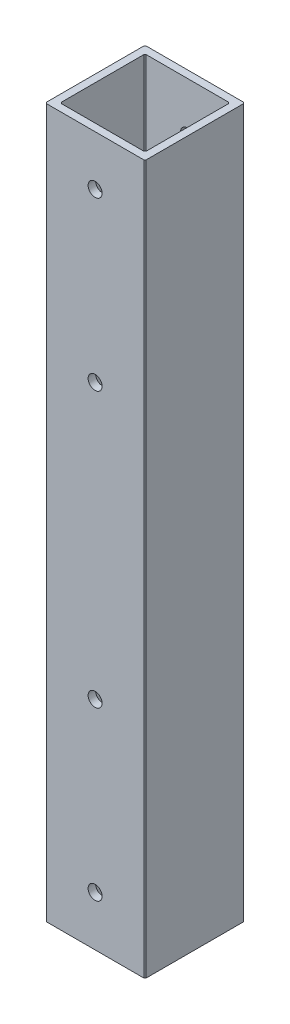
ISO-10303-21;
HEADER;
FILE_DESCRIPTION(('STEP AP214'),'2;1');
FILE_NAME('part.step','',(''),(''),'','','');
FILE_SCHEMA(('AUTOMOTIVE_DESIGN { 1 0 10303 214 1 1 1 1 }'));
ENDSEC;
DATA;
#1=APPLICATION_CONTEXT('core data for automotive mechanical design processes');
#2=APPLICATION_PROTOCOL_DEFINITION('international standard','automotive_design',2000,#1);
#3=PRODUCT_CONTEXT('',#1,'mechanical');
#4=PRODUCT('Part','Part','',(#3));
#5=PRODUCT_RELATED_PRODUCT_CATEGORY('part','',(#4));
#6=PRODUCT_DEFINITION_FORMATION('','',#4);
#7=PRODUCT_DEFINITION_CONTEXT('part definition',#1,'design');
#8=PRODUCT_DEFINITION('design','',#6,#7);
#9=PRODUCT_DEFINITION_SHAPE('','',#8);
#10=(LENGTH_UNIT() NAMED_UNIT(*) SI_UNIT(.MILLI.,.METRE.));
#11=(NAMED_UNIT(*) PLANE_ANGLE_UNIT() SI_UNIT($,.RADIAN.));
#12=(NAMED_UNIT(*) SI_UNIT($,.STERADIAN.) SOLID_ANGLE_UNIT());
#13=UNCERTAINTY_MEASURE_WITH_UNIT(LENGTH_MEASURE(1.E-05),#10,'distance_accuracy_value','');
#14=(GEOMETRIC_REPRESENTATION_CONTEXT(3) GLOBAL_UNCERTAINTY_ASSIGNED_CONTEXT((#13)) GLOBAL_UNIT_ASSIGNED_CONTEXT((#10,
#11,#12)) REPRESENTATION_CONTEXT('',''));
#15=CARTESIAN_POINT('',(0.,0.,0.));
#16=DIRECTION('',(0.,0.,1.));
#17=DIRECTION('',(1.,0.,0.));
#18=AXIS2_PLACEMENT_3D('',#15,#16,#17);
#19=CARTESIAN_POINT('',(0.,0.,140.));
#20=DIRECTION('',(0.,0.,1.));
#21=DIRECTION('',(1.,0.,0.));
#22=AXIS2_PLACEMENT_3D('',#19,#20,#21);
#23=PLANE('',#22);
#24=CARTESIAN_POINT('',(100.,55.,140.));
#25=DIRECTION('',(0.,0.,-1.));
#26=DIRECTION('',(-1.,0.,0.));
#27=AXIS2_PLACEMENT_3D('',#24,#25,#26);
#28=CIRCLE('',#27,2.79999999999998);
#29=CARTESIAN_POINT('',(97.2,55.,140.));
#30=VERTEX_POINT('',#29);
#31=EDGE_CURVE('E536',#30,#30,#28,.T.);
#32=ORIENTED_EDGE('',*,*,#31,.F.);
#33=EDGE_LOOP('',(#32));
#34=FACE_BOUND('',#33,.T.);
#35=CARTESIAN_POINT('',(100.,-122.,140.));
#36=DIRECTION('',(0.,0.,-1.));
#37=DIRECTION('',(-1.,0.,0.));
#38=AXIS2_PLACEMENT_3D('',#35,#36,#37);
#39=CIRCLE('',#38,2.79999999999998);
#40=CARTESIAN_POINT('',(97.2,-122.,140.));
#41=VERTEX_POINT('',#40);
#42=EDGE_CURVE('E551',#41,#41,#39,.T.);
#43=ORIENTED_EDGE('',*,*,#42,.F.);
#44=EDGE_LOOP('',(#43));
#45=FACE_BOUND('',#44,.T.);
#46=DIRECTION('',(-1.,0.,0.));
#47=VECTOR('',#46,1.);
#48=CARTESIAN_POINT('',(120.,142.,140.));
#49=LINE('',#48,#47);
#50=CARTESIAN_POINT('',(119.5,142.,140.));
#51=VERTEX_POINT('',#50);
#52=CARTESIAN_POINT('',(80.5000000000001,142.,140.));
#53=VERTEX_POINT('',#52);
#54=EDGE_CURVE('E336',#51,#53,#49,.T.);
#55=ORIENTED_EDGE('',*,*,#54,.F.);
#56=DIRECTION('',(0.,-1.,0.));
#57=VECTOR('',#56,1.);
#58=CARTESIAN_POINT('',(119.5,-142.,140.));
#59=LINE('',#58,#57);
#60=CARTESIAN_POINT('',(119.5,-142.,140.));
#61=VERTEX_POINT('',#60);
#62=EDGE_CURVE('E209',#51,#61,#59,.T.);
#63=ORIENTED_EDGE('',*,*,#62,.T.);
#64=DIRECTION('',(1.,0.,0.));
#65=VECTOR('',#64,1.);
#66=CARTESIAN_POINT('',(80.,-142.,140.));
#67=LINE('',#66,#65);
#68=CARTESIAN_POINT('',(80.5,-142.,140.));
#69=VERTEX_POINT('',#68);
#70=EDGE_CURVE('E167',#69,#61,#67,.T.);
#71=ORIENTED_EDGE('',*,*,#70,.F.);
#72=DIRECTION('',(0.,1.,0.));
#73=VECTOR('',#72,1.);
#74=CARTESIAN_POINT('',(80.5000000000001,142.,140.));
#75=LINE('',#74,#73);
#76=EDGE_CURVE('E206',#69,#53,#75,.T.);
#77=ORIENTED_EDGE('',*,*,#76,.T.);
#78=EDGE_LOOP('',(#55,#63,#71,#77));
#79=FACE_BOUND('',#78,.T.);
#80=CARTESIAN_POINT('',(100.,-55.,140.));
#81=DIRECTION('',(0.,0.,-1.));
#82=DIRECTION('',(-1.,0.,0.));
#83=AXIS2_PLACEMENT_3D('',#80,#81,#82);
#84=CIRCLE('',#83,2.79999999999998);
#85=CARTESIAN_POINT('',(97.2,-55.,140.));
#86=VERTEX_POINT('',#85);
#87=EDGE_CURVE('E544',#86,#86,#84,.T.);
#88=ORIENTED_EDGE('',*,*,#87,.F.);
#89=EDGE_LOOP('',(#88));
#90=FACE_BOUND('',#89,.T.);
#91=CARTESIAN_POINT('',(100.,122.,140.));
#92=DIRECTION('',(0.,0.,-1.));
#93=DIRECTION('',(-1.,0.,0.));
#94=AXIS2_PLACEMENT_3D('',#91,#92,#93);
#95=CIRCLE('',#94,2.79999999999998);
#96=CARTESIAN_POINT('',(97.2,122.,140.));
#97=VERTEX_POINT('',#96);
#98=EDGE_CURVE('E528',#97,#97,#95,.T.);
#99=ORIENTED_EDGE('',*,*,#98,.F.);
#100=EDGE_LOOP('',(#99));
#101=FACE_BOUND('',#100,.T.);
#102=ADVANCED_FACE('F45',(#34,#45,#79,#90,#101),#23,.F.);
#103=CARTESIAN_POINT('',(80.0000000000001,142.,140.));
#104=DIRECTION('',(-1.,0.,0.));
#105=DIRECTION('',(0.,-1.,0.));
#106=AXIS2_PLACEMENT_3D('',#103,#104,#105);
#107=PLANE('',#106);
#108=DIRECTION('',(0.,0.,1.));
#109=VECTOR('',#108,1.);
#110=CARTESIAN_POINT('',(80.0000000000001,142.,140.));
#111=LINE('',#110,#109);
#112=CARTESIAN_POINT('',(80.0000000000001,142.,140.5));
#113=VERTEX_POINT('',#112);
#114=CARTESIAN_POINT('',(80.0000000000001,142.,179.5));
#115=VERTEX_POINT('',#114);
#116=EDGE_CURVE('E195',#113,#115,#111,.T.);
#117=ORIENTED_EDGE('',*,*,#116,.F.);
#118=DIRECTION('',(0.,-1.,0.));
#119=VECTOR('',#118,1.);
#120=CARTESIAN_POINT('',(80.,-142.,140.5));
#121=LINE('',#120,#119);
#122=CARTESIAN_POINT('',(80.,-142.,140.5));
#123=VERTEX_POINT('',#122);
#124=EDGE_CURVE('E221',#113,#123,#121,.T.);
#125=ORIENTED_EDGE('',*,*,#124,.T.);
#126=DIRECTION('',(0.,0.,1.));
#127=VECTOR('',#126,1.);
#128=CARTESIAN_POINT('',(80.,-142.,140.));
#129=LINE('',#128,#127);
#130=CARTESIAN_POINT('',(80.,-142.,179.5));
#131=VERTEX_POINT('',#130);
#132=EDGE_CURVE('E184',#123,#131,#129,.T.);
#133=ORIENTED_EDGE('',*,*,#132,.T.);
#134=DIRECTION('',(0.,1.,0.));
#135=VECTOR('',#134,1.);
#136=CARTESIAN_POINT('',(80.0000000000001,142.,179.5));
#137=LINE('',#136,#135);
#138=EDGE_CURVE('E172',#131,#115,#137,.T.);
#139=ORIENTED_EDGE('',*,*,#138,.T.);
#140=EDGE_LOOP('',(#117,#125,#133,#139));
#141=FACE_BOUND('',#140,.T.);
#142=ADVANCED_FACE('F355',(#141),#107,.T.);
#143=CARTESIAN_POINT('',(120.,142.,140.));
#144=DIRECTION('',(0.,1.,0.));
#145=DIRECTION('',(0.,0.,1.));
#146=AXIS2_PLACEMENT_3D('',#143,#144,#145);
#147=PLANE('',#146);
#148=DIRECTION('',(0.,0.,-1.));
#149=VECTOR('',#148,1.);
#150=CARTESIAN_POINT('',(83.,142.,177.));
#151=LINE('',#150,#149);
#152=CARTESIAN_POINT('',(83.,142.,176.5));
#153=VERTEX_POINT('',#152);
#154=CARTESIAN_POINT('',(83.,142.,143.5));
#155=VERTEX_POINT('',#154);
#156=EDGE_CURVE('E304',#153,#155,#151,.T.);
#157=ORIENTED_EDGE('',*,*,#156,.T.);
#158=DIRECTION('',(-0.707106781186548,0.,0.707106781186548));
#159=VECTOR('',#158,1.);
#160=CARTESIAN_POINT('',(83.5,142.,143.));
#161=LINE('',#160,#159);
#162=CARTESIAN_POINT('',(83.5,142.,143.));
#163=VERTEX_POINT('',#162);
#164=EDGE_CURVE('E11',#155,#163,#161,.F.);
#165=ORIENTED_EDGE('',*,*,#164,.T.);
#166=DIRECTION('',(1.,0.,0.));
#167=VECTOR('',#166,1.);
#168=CARTESIAN_POINT('',(83.,142.,143.));
#169=LINE('',#168,#167);
#170=CARTESIAN_POINT('',(116.5,142.,143.));
#171=VERTEX_POINT('',#170);
#172=EDGE_CURVE('E294',#163,#171,#169,.T.);
#173=ORIENTED_EDGE('',*,*,#172,.T.);
#174=DIRECTION('',(-0.707106781186548,0.,-0.707106781186548));
#175=VECTOR('',#174,1.);
#176=CARTESIAN_POINT('',(117.,142.,143.5));
#177=LINE('',#176,#175);
#178=CARTESIAN_POINT('',(117.,142.,143.5));
#179=VERTEX_POINT('',#178);
#180=EDGE_CURVE('E269',#171,#179,#177,.F.);
#181=ORIENTED_EDGE('',*,*,#180,.T.);
#182=DIRECTION('',(0.,0.,1.));
#183=VECTOR('',#182,1.);
#184=CARTESIAN_POINT('',(117.,142.,143.));
#185=LINE('',#184,#183);
#186=CARTESIAN_POINT('',(117.,142.,176.5));
#187=VERTEX_POINT('',#186);
#188=EDGE_CURVE('E309',#179,#187,#185,.T.);
#189=ORIENTED_EDGE('',*,*,#188,.T.);
#190=DIRECTION('',(0.707106781186548,0.,-0.707106781186548));
#191=VECTOR('',#190,1.);
#192=CARTESIAN_POINT('',(116.5,142.,177.));
#193=LINE('',#192,#191);
#194=CARTESIAN_POINT('',(116.5,142.,177.));
#195=VERTEX_POINT('',#194);
#196=EDGE_CURVE('E275',#187,#195,#193,.F.);
#197=ORIENTED_EDGE('',*,*,#196,.T.);
#198=DIRECTION('',(-1.,0.,0.));
#199=VECTOR('',#198,1.);
#200=CARTESIAN_POINT('',(117.,142.,177.));
#201=LINE('',#200,#199);
#202=CARTESIAN_POINT('',(83.5,142.,177.));
#203=VERTEX_POINT('',#202);
#204=EDGE_CURVE('E313',#195,#203,#201,.T.);
#205=ORIENTED_EDGE('',*,*,#204,.T.);
#206=DIRECTION('',(0.707106781186548,0.,0.707106781186548));
#207=VECTOR('',#206,1.);
#208=CARTESIAN_POINT('',(83.,142.,176.5));
#209=LINE('',#208,#207);
#210=EDGE_CURVE('E263',#203,#153,#209,.F.);
#211=ORIENTED_EDGE('',*,*,#210,.T.);
#212=EDGE_LOOP('',(#157,#165,#173,#181,#189,#197,#205,#211));
#213=FACE_BOUND('',#212,.T.);
#214=DIRECTION('',(0.,0.,1.));
#215=VECTOR('',#214,1.);
#216=CARTESIAN_POINT('',(120.,142.,140.));
#217=LINE('',#216,#215);
#218=CARTESIAN_POINT('',(120.,142.,140.5));
#219=VERTEX_POINT('',#218);
#220=CARTESIAN_POINT('',(120.,142.,179.5));
#221=VERTEX_POINT('',#220);
#222=EDGE_CURVE('E183',#219,#221,#217,.T.);
#223=ORIENTED_EDGE('',*,*,#222,.F.);
#224=DIRECTION('',(-0.707106781186552,0.,-0.707106781186543));
#225=VECTOR('',#224,1.);
#226=CARTESIAN_POINT('',(119.75,142.,140.25));
#227=LINE('',#226,#225);
#228=EDGE_CURVE('E187',#219,#51,#227,.T.);
#229=ORIENTED_EDGE('',*,*,#228,.T.);
#230=ORIENTED_EDGE('',*,*,#54,.T.);
#231=DIRECTION('',(-0.707106781186552,0.,0.707106781186543));
#232=VECTOR('',#231,1.);
#233=CARTESIAN_POINT('',(100.25,142.,120.25));
#234=LINE('',#233,#232);
#235=EDGE_CURVE('E201',#53,#113,#234,.T.);
#236=ORIENTED_EDGE('',*,*,#235,.T.);
#237=ORIENTED_EDGE('',*,*,#116,.T.);
#238=DIRECTION('',(-0.707106781186552,0.,-0.707106781186543));
#239=VECTOR('',#238,1.);
#240=CARTESIAN_POINT('',(80.2500000000003,142.,179.75));
#241=LINE('',#240,#239);
#242=CARTESIAN_POINT('',(80.5,142.,180.));
#243=VERTEX_POINT('',#242);
#244=EDGE_CURVE('E193',#115,#243,#241,.F.);
#245=ORIENTED_EDGE('',*,*,#244,.T.);
#246=DIRECTION('',(-1.,0.,0.));
#247=VECTOR('',#246,1.);
#248=CARTESIAN_POINT('',(120.,142.,180.));
#249=LINE('',#248,#247);
#250=CARTESIAN_POINT('',(119.5,142.,180.));
#251=VERTEX_POINT('',#250);
#252=EDGE_CURVE('E337',#251,#243,#249,.T.);
#253=ORIENTED_EDGE('',*,*,#252,.F.);
#254=DIRECTION('',(-0.707106781186552,0.,0.707106781186543));
#255=VECTOR('',#254,1.);
#256=CARTESIAN_POINT('',(139.75,142.,159.75));
#257=LINE('',#256,#255);
#258=EDGE_CURVE('E189',#251,#221,#257,.F.);
#259=ORIENTED_EDGE('',*,*,#258,.T.);
#260=EDGE_LOOP('',(#223,#229,#230,#236,#237,#245,#253,#259));
#261=FACE_BOUND('',#260,.T.);
#262=ADVANCED_FACE('F301',(#213,#261),#147,.T.);
#263=CARTESIAN_POINT('',(120.,-142.,140.));
#264=DIRECTION('',(1.,0.,0.));
#265=DIRECTION('',(0.,1.,0.));
#266=AXIS2_PLACEMENT_3D('',#263,#264,#265);
#267=PLANE('',#266);
#268=DIRECTION('',(0.,0.,1.));
#269=VECTOR('',#268,1.);
#270=CARTESIAN_POINT('',(120.,-142.,140.));
#271=LINE('',#270,#269);
#272=CARTESIAN_POINT('',(120.,-142.,140.5));
#273=VERTEX_POINT('',#272);
#274=CARTESIAN_POINT('',(120.,-142.,179.5));
#275=VERTEX_POINT('',#274);
#276=EDGE_CURVE('E164',#273,#275,#271,.T.);
#277=ORIENTED_EDGE('',*,*,#276,.F.);
#278=DIRECTION('',(0.,1.,0.));
#279=VECTOR('',#278,1.);
#280=CARTESIAN_POINT('',(120.,142.,140.5));
#281=LINE('',#280,#279);
#282=EDGE_CURVE('E178',#273,#219,#281,.T.);
#283=ORIENTED_EDGE('',*,*,#282,.T.);
#284=ORIENTED_EDGE('',*,*,#222,.T.);
#285=DIRECTION('',(0.,-1.,0.));
#286=VECTOR('',#285,1.);
#287=CARTESIAN_POINT('',(120.,-142.,179.5));
#288=LINE('',#287,#286);
#289=EDGE_CURVE('E181',#221,#275,#288,.T.);
#290=ORIENTED_EDGE('',*,*,#289,.T.);
#291=EDGE_LOOP('',(#277,#283,#284,#290));
#292=FACE_BOUND('',#291,.T.);
#293=ADVANCED_FACE('F176',(#292),#267,.T.);
#294=CARTESIAN_POINT('',(80.,-142.,140.));
#295=DIRECTION('',(0.,-1.,0.));
#296=DIRECTION('',(0.,0.,-1.));
#297=AXIS2_PLACEMENT_3D('',#294,#295,#296);
#298=PLANE('',#297);
#299=DIRECTION('',(1.,0.,0.));
#300=VECTOR('',#299,1.);
#301=CARTESIAN_POINT('',(83.,-142.,143.));
#302=LINE('',#301,#300);
#303=CARTESIAN_POINT('',(83.5,-142.,143.));
#304=VERTEX_POINT('',#303);
#305=CARTESIAN_POINT('',(116.5,-142.,143.));
#306=VERTEX_POINT('',#305);
#307=EDGE_CURVE('E284',#304,#306,#302,.T.);
#308=ORIENTED_EDGE('',*,*,#307,.F.);
#309=DIRECTION('',(0.707106781186548,0.,-0.707106781186548));
#310=VECTOR('',#309,1.);
#311=CARTESIAN_POINT('',(83.5,-142.,143.));
#312=LINE('',#311,#310);
#313=CARTESIAN_POINT('',(83.,-142.,143.5));
#314=VERTEX_POINT('',#313);
#315=EDGE_CURVE('E55',#304,#314,#312,.F.);
#316=ORIENTED_EDGE('',*,*,#315,.T.);
#317=DIRECTION('',(0.,0.,-1.));
#318=VECTOR('',#317,1.);
#319=CARTESIAN_POINT('',(83.,-142.,177.));
#320=LINE('',#319,#318);
#321=CARTESIAN_POINT('',(83.,-142.,176.5));
#322=VERTEX_POINT('',#321);
#323=EDGE_CURVE('E282',#322,#314,#320,.T.);
#324=ORIENTED_EDGE('',*,*,#323,.F.);
#325=DIRECTION('',(-0.707106781186548,0.,-0.707106781186548));
#326=VECTOR('',#325,1.);
#327=CARTESIAN_POINT('',(83.,-142.,176.5));
#328=LINE('',#327,#326);
#329=CARTESIAN_POINT('',(83.5,-142.,177.));
#330=VERTEX_POINT('',#329);
#331=EDGE_CURVE('E260',#322,#330,#328,.F.);
#332=ORIENTED_EDGE('',*,*,#331,.T.);
#333=DIRECTION('',(-1.,0.,0.));
#334=VECTOR('',#333,1.);
#335=CARTESIAN_POINT('',(117.,-142.,177.));
#336=LINE('',#335,#334);
#337=CARTESIAN_POINT('',(116.5,-142.,177.));
#338=VERTEX_POINT('',#337);
#339=EDGE_CURVE('E295',#338,#330,#336,.T.);
#340=ORIENTED_EDGE('',*,*,#339,.F.);
#341=DIRECTION('',(-0.707106781186548,0.,0.707106781186548));
#342=VECTOR('',#341,1.);
#343=CARTESIAN_POINT('',(116.5,-142.,177.));
#344=LINE('',#343,#342);
#345=CARTESIAN_POINT('',(117.,-142.,176.5));
#346=VERTEX_POINT('',#345);
#347=EDGE_CURVE('E272',#338,#346,#344,.F.);
#348=ORIENTED_EDGE('',*,*,#347,.T.);
#349=DIRECTION('',(0.,0.,1.));
#350=VECTOR('',#349,1.);
#351=CARTESIAN_POINT('',(117.,-142.,143.));
#352=LINE('',#351,#350);
#353=CARTESIAN_POINT('',(117.,-142.,143.5));
#354=VERTEX_POINT('',#353);
#355=EDGE_CURVE('E327',#354,#346,#352,.T.);
#356=ORIENTED_EDGE('',*,*,#355,.F.);
#357=DIRECTION('',(0.707106781186548,0.,0.707106781186548));
#358=VECTOR('',#357,1.);
#359=CARTESIAN_POINT('',(117.,-142.,143.5));
#360=LINE('',#359,#358);
#361=EDGE_CURVE('E266',#354,#306,#360,.F.);
#362=ORIENTED_EDGE('',*,*,#361,.T.);
#363=EDGE_LOOP('',(#308,#316,#324,#332,#340,#348,#356,#362));
#364=FACE_BOUND('',#363,.T.);
#365=ORIENTED_EDGE('',*,*,#70,.T.);
#366=DIRECTION('',(0.707106781186552,0.,0.707106781186543));
#367=VECTOR('',#366,1.);
#368=CARTESIAN_POINT('',(99.7499999999997,-142.,120.25));
#369=LINE('',#368,#367);
#370=EDGE_CURVE('E161',#61,#273,#369,.T.);
#371=ORIENTED_EDGE('',*,*,#370,.T.);
#372=ORIENTED_EDGE('',*,*,#276,.T.);
#373=DIRECTION('',(0.707106781186552,0.,-0.707106781186543));
#374=VECTOR('',#373,1.);
#375=CARTESIAN_POINT('',(119.75,-142.,179.75));
#376=LINE('',#375,#374);
#377=CARTESIAN_POINT('',(119.5,-142.,180.));
#378=VERTEX_POINT('',#377);
#379=EDGE_CURVE('E212',#275,#378,#376,.F.);
#380=ORIENTED_EDGE('',*,*,#379,.T.);
#381=DIRECTION('',(1.,0.,0.));
#382=VECTOR('',#381,1.);
#383=CARTESIAN_POINT('',(80.,-142.,180.));
#384=LINE('',#383,#382);
#385=CARTESIAN_POINT('',(80.4999999999999,-142.,180.));
#386=VERTEX_POINT('',#385);
#387=EDGE_CURVE('E324',#386,#378,#384,.T.);
#388=ORIENTED_EDGE('',*,*,#387,.F.);
#389=DIRECTION('',(0.707106781186552,0.,0.707106781186543));
#390=VECTOR('',#389,1.);
#391=CARTESIAN_POINT('',(60.25,-142.,159.75));
#392=LINE('',#391,#390);
#393=EDGE_CURVE('E62',#386,#131,#392,.F.);
#394=ORIENTED_EDGE('',*,*,#393,.T.);
#395=ORIENTED_EDGE('',*,*,#132,.F.);
#396=DIRECTION('',(0.707106781186552,0.,-0.707106781186543));
#397=VECTOR('',#396,1.);
#398=CARTESIAN_POINT('',(80.25,-142.,140.25));
#399=LINE('',#398,#397);
#400=EDGE_CURVE('E70',#123,#69,#399,.T.);
#401=ORIENTED_EDGE('',*,*,#400,.T.);
#402=EDGE_LOOP('',(#365,#371,#372,#380,#388,#394,#395,#401));
#403=FACE_BOUND('',#402,.T.);
#404=ADVANCED_FACE('F163',(#364,#403),#298,.T.);
#405=CARTESIAN_POINT('',(0.,0.,180.));
#406=DIRECTION('',(0.,0.,1.));
#407=DIRECTION('',(1.,0.,0.));
#408=AXIS2_PLACEMENT_3D('',#405,#406,#407);
#409=PLANE('',#408);
#410=CARTESIAN_POINT('',(100.,122.,180.));
#411=DIRECTION('',(0.,0.,-1.));
#412=DIRECTION('',(-1.,0.,0.));
#413=AXIS2_PLACEMENT_3D('',#410,#411,#412);
#414=CIRCLE('',#413,2.79999999999998);
#415=CARTESIAN_POINT('',(97.2,122.,180.));
#416=VERTEX_POINT('',#415);
#417=EDGE_CURVE('E495',#416,#416,#414,.T.);
#418=ORIENTED_EDGE('',*,*,#417,.T.);
#419=EDGE_LOOP('',(#418));
#420=FACE_BOUND('',#419,.T.);
#421=CARTESIAN_POINT('',(100.,55.,180.));
#422=DIRECTION('',(0.,0.,-1.));
#423=DIRECTION('',(-1.,0.,0.));
#424=AXIS2_PLACEMENT_3D('',#421,#422,#423);
#425=CIRCLE('',#424,2.79999999999998);
#426=CARTESIAN_POINT('',(97.2,55.,180.));
#427=VERTEX_POINT('',#426);
#428=EDGE_CURVE('E508',#427,#427,#425,.T.);
#429=ORIENTED_EDGE('',*,*,#428,.T.);
#430=EDGE_LOOP('',(#429));
#431=FACE_BOUND('',#430,.T.);
#432=CARTESIAN_POINT('',(100.,-55.,180.));
#433=DIRECTION('',(0.,0.,-1.));
#434=DIRECTION('',(-1.,0.,0.));
#435=AXIS2_PLACEMENT_3D('',#432,#433,#434);
#436=CIRCLE('',#435,2.79999999999998);
#437=CARTESIAN_POINT('',(97.2,-55.,180.));
#438=VERTEX_POINT('',#437);
#439=EDGE_CURVE('E516',#438,#438,#436,.T.);
#440=ORIENTED_EDGE('',*,*,#439,.T.);
#441=EDGE_LOOP('',(#440));
#442=FACE_BOUND('',#441,.T.);
#443=CARTESIAN_POINT('',(100.,-122.,180.));
#444=DIRECTION('',(0.,0.,-1.));
#445=DIRECTION('',(-1.,0.,0.));
#446=AXIS2_PLACEMENT_3D('',#443,#444,#445);
#447=CIRCLE('',#446,2.79999999999998);
#448=CARTESIAN_POINT('',(97.2,-122.,180.));
#449=VERTEX_POINT('',#448);
#450=EDGE_CURVE('E524',#449,#449,#447,.T.);
#451=ORIENTED_EDGE('',*,*,#450,.T.);
#452=EDGE_LOOP('',(#451));
#453=FACE_BOUND('',#452,.T.);
#454=ORIENTED_EDGE('',*,*,#252,.T.);
#455=DIRECTION('',(0.,-1.,0.));
#456=VECTOR('',#455,1.);
#457=CARTESIAN_POINT('',(80.5,0.,180.));
#458=LINE('',#457,#456);
#459=EDGE_CURVE('E228',#243,#386,#458,.T.);
#460=ORIENTED_EDGE('',*,*,#459,.T.);
#461=ORIENTED_EDGE('',*,*,#387,.T.);
#462=DIRECTION('',(0.,1.,0.));
#463=VECTOR('',#462,1.);
#464=CARTESIAN_POINT('',(119.5,0.,180.));
#465=LINE('',#464,#463);
#466=EDGE_CURVE('E224',#378,#251,#465,.T.);
#467=ORIENTED_EDGE('',*,*,#466,.T.);
#468=EDGE_LOOP('',(#454,#460,#461,#467));
#469=FACE_BOUND('',#468,.T.);
#470=ADVANCED_FACE('F362',(#420,#431,#442,#453,#469),#409,.T.);
#471=CARTESIAN_POINT('',(83.,142.,143.));
#472=DIRECTION('',(0.,0.,-1.));
#473=DIRECTION('',(-1.,0.,0.));
#474=AXIS2_PLACEMENT_3D('',#471,#472,#473);
#475=PLANE('',#474);
#476=CARTESIAN_POINT('',(100.,122.,143.));
#477=DIRECTION('',(0.,0.,-1.));
#478=DIRECTION('',(-1.,0.,0.));
#479=AXIS2_PLACEMENT_3D('',#476,#477,#478);
#480=CIRCLE('',#479,2.79999999999999);
#481=CARTESIAN_POINT('',(97.2,122.,143.));
#482=VERTEX_POINT('',#481);
#483=EDGE_CURVE('E532',#482,#482,#480,.T.);
#484=ORIENTED_EDGE('',*,*,#483,.T.);
#485=EDGE_LOOP('',(#484));
#486=FACE_BOUND('',#485,.T.);
#487=CARTESIAN_POINT('',(100.,55.,143.));
#488=DIRECTION('',(0.,0.,-1.));
#489=DIRECTION('',(-1.,0.,0.));
#490=AXIS2_PLACEMENT_3D('',#487,#488,#489);
#491=CIRCLE('',#490,2.79999999999999);
#492=CARTESIAN_POINT('',(97.2,55.,143.));
#493=VERTEX_POINT('',#492);
#494=EDGE_CURVE('E540',#493,#493,#491,.T.);
#495=ORIENTED_EDGE('',*,*,#494,.T.);
#496=EDGE_LOOP('',(#495));
#497=FACE_BOUND('',#496,.T.);
#498=CARTESIAN_POINT('',(100.,-55.,143.));
#499=DIRECTION('',(0.,0.,-1.));
#500=DIRECTION('',(-1.,0.,0.));
#501=AXIS2_PLACEMENT_3D('',#498,#499,#500);
#502=CIRCLE('',#501,2.79999999999999);
#503=CARTESIAN_POINT('',(97.2,-55.,143.));
#504=VERTEX_POINT('',#503);
#505=EDGE_CURVE('E548',#504,#504,#502,.T.);
#506=ORIENTED_EDGE('',*,*,#505,.T.);
#507=EDGE_LOOP('',(#506));
#508=FACE_BOUND('',#507,.T.);
#509=CARTESIAN_POINT('',(100.,-122.,143.));
#510=DIRECTION('',(0.,0.,-1.));
#511=DIRECTION('',(-1.,0.,0.));
#512=AXIS2_PLACEMENT_3D('',#509,#510,#511);
#513=CIRCLE('',#512,2.79999999999999);
#514=CARTESIAN_POINT('',(97.2,-122.,143.));
#515=VERTEX_POINT('',#514);
#516=EDGE_CURVE('E316',#515,#515,#513,.T.);
#517=ORIENTED_EDGE('',*,*,#516,.T.);
#518=EDGE_LOOP('',(#517));
#519=FACE_BOUND('',#518,.T.);
#520=ORIENTED_EDGE('',*,*,#307,.T.);
#521=DIRECTION('',(0.,1.,0.));
#522=VECTOR('',#521,1.);
#523=CARTESIAN_POINT('',(116.5,142.,143.));
#524=LINE('',#523,#522);
#525=EDGE_CURVE('E257',#306,#171,#524,.T.);
#526=ORIENTED_EDGE('',*,*,#525,.T.);
#527=ORIENTED_EDGE('',*,*,#172,.F.);
#528=DIRECTION('',(0.,-1.,0.));
#529=VECTOR('',#528,1.);
#530=CARTESIAN_POINT('',(83.5,-142.,143.));
#531=LINE('',#530,#529);
#532=EDGE_CURVE('E253',#163,#304,#531,.T.);
#533=ORIENTED_EDGE('',*,*,#532,.T.);
#534=EDGE_LOOP('',(#520,#526,#527,#533));
#535=FACE_BOUND('',#534,.T.);
#536=ADVANCED_FACE('F306',(#486,#497,#508,#519,#535),#475,.F.);
#537=CARTESIAN_POINT('',(83.,142.,177.));
#538=DIRECTION('',(-1.,0.,0.));
#539=DIRECTION('',(0.,0.,1.));
#540=AXIS2_PLACEMENT_3D('',#537,#538,#539);
#541=PLANE('',#540);
#542=ORIENTED_EDGE('',*,*,#156,.F.);
#543=DIRECTION('',(0.,-1.,0.));
#544=VECTOR('',#543,1.);
#545=CARTESIAN_POINT('',(83.,-142.,176.5));
#546=LINE('',#545,#544);
#547=EDGE_CURVE('E235',#153,#322,#546,.T.);
#548=ORIENTED_EDGE('',*,*,#547,.T.);
#549=ORIENTED_EDGE('',*,*,#323,.T.);
#550=DIRECTION('',(0.,1.,0.));
#551=VECTOR('',#550,1.);
#552=CARTESIAN_POINT('',(83.,142.,143.5));
#553=LINE('',#552,#551);
#554=EDGE_CURVE('E232',#314,#155,#553,.T.);
#555=ORIENTED_EDGE('',*,*,#554,.T.);
#556=EDGE_LOOP('',(#542,#548,#549,#555));
#557=FACE_BOUND('',#556,.T.);
#558=ADVANCED_FACE('F290',(#557),#541,.F.);
#559=CARTESIAN_POINT('',(117.,142.,177.));
#560=DIRECTION('',(0.,0.,1.));
#561=DIRECTION('',(1.,0.,0.));
#562=AXIS2_PLACEMENT_3D('',#559,#560,#561);
#563=PLANE('',#562);
#564=CARTESIAN_POINT('',(100.,122.,177.));
#565=DIRECTION('',(0.,0.,-1.));
#566=DIRECTION('',(-1.,0.,0.));
#567=AXIS2_PLACEMENT_3D('',#564,#565,#566);
#568=CIRCLE('',#567,2.79999999999998);
#569=CARTESIAN_POINT('',(97.2,122.,177.));
#570=VERTEX_POINT('',#569);
#571=EDGE_CURVE('E498',#570,#570,#568,.T.);
#572=ORIENTED_EDGE('',*,*,#571,.F.);
#573=EDGE_LOOP('',(#572));
#574=FACE_BOUND('',#573,.T.);
#575=CARTESIAN_POINT('',(100.,55.,177.));
#576=DIRECTION('',(0.,0.,-1.));
#577=DIRECTION('',(-1.,0.,0.));
#578=AXIS2_PLACEMENT_3D('',#575,#576,#577);
#579=CIRCLE('',#578,2.79999999999998);
#580=CARTESIAN_POINT('',(97.2,55.,177.));
#581=VERTEX_POINT('',#580);
#582=EDGE_CURVE('E502',#581,#581,#579,.T.);
#583=ORIENTED_EDGE('',*,*,#582,.F.);
#584=EDGE_LOOP('',(#583));
#585=FACE_BOUND('',#584,.T.);
#586=CARTESIAN_POINT('',(100.,-55.,177.));
#587=DIRECTION('',(0.,0.,-1.));
#588=DIRECTION('',(-1.,0.,0.));
#589=AXIS2_PLACEMENT_3D('',#586,#587,#588);
#590=CIRCLE('',#589,2.79999999999998);
#591=CARTESIAN_POINT('',(97.2,-55.,177.));
#592=VERTEX_POINT('',#591);
#593=EDGE_CURVE('E512',#592,#592,#590,.T.);
#594=ORIENTED_EDGE('',*,*,#593,.F.);
#595=EDGE_LOOP('',(#594));
#596=FACE_BOUND('',#595,.T.);
#597=CARTESIAN_POINT('',(100.,-122.,177.));
#598=DIRECTION('',(0.,0.,-1.));
#599=DIRECTION('',(-1.,0.,0.));
#600=AXIS2_PLACEMENT_3D('',#597,#598,#599);
#601=CIRCLE('',#600,2.79999999999998);
#602=CARTESIAN_POINT('',(97.2,-122.,177.));
#603=VERTEX_POINT('',#602);
#604=EDGE_CURVE('E520',#603,#603,#601,.T.);
#605=ORIENTED_EDGE('',*,*,#604,.F.);
#606=EDGE_LOOP('',(#605));
#607=FACE_BOUND('',#606,.T.);
#608=ORIENTED_EDGE('',*,*,#339,.T.);
#609=DIRECTION('',(0.,1.,0.));
#610=VECTOR('',#609,1.);
#611=CARTESIAN_POINT('',(83.5,142.,177.));
#612=LINE('',#611,#610);
#613=EDGE_CURVE('E243',#330,#203,#612,.T.);
#614=ORIENTED_EDGE('',*,*,#613,.T.);
#615=ORIENTED_EDGE('',*,*,#204,.F.);
#616=DIRECTION('',(0.,-1.,0.));
#617=VECTOR('',#616,1.);
#618=CARTESIAN_POINT('',(116.5,-142.,177.));
#619=LINE('',#618,#617);
#620=EDGE_CURVE('E239',#195,#338,#619,.T.);
#621=ORIENTED_EDGE('',*,*,#620,.T.);
#622=EDGE_LOOP('',(#608,#614,#615,#621));
#623=FACE_BOUND('',#622,.T.);
#624=ADVANCED_FACE('F443',(#574,#585,#596,#607,#623),#563,.F.);
#625=CARTESIAN_POINT('',(117.,142.,143.));
#626=DIRECTION('',(1.,0.,0.));
#627=DIRECTION('',(0.,0.,-1.));
#628=AXIS2_PLACEMENT_3D('',#625,#626,#627);
#629=PLANE('',#628);
#630=ORIENTED_EDGE('',*,*,#188,.F.);
#631=DIRECTION('',(0.,-1.,0.));
#632=VECTOR('',#631,1.);
#633=CARTESIAN_POINT('',(117.,-142.,143.5));
#634=LINE('',#633,#632);
#635=EDGE_CURVE('E249',#179,#354,#634,.T.);
#636=ORIENTED_EDGE('',*,*,#635,.T.);
#637=ORIENTED_EDGE('',*,*,#355,.T.);
#638=DIRECTION('',(0.,1.,0.));
#639=VECTOR('',#638,1.);
#640=CARTESIAN_POINT('',(117.,142.,176.5));
#641=LINE('',#640,#639);
#642=EDGE_CURVE('E246',#346,#187,#641,.T.);
#643=ORIENTED_EDGE('',*,*,#642,.T.);
#644=EDGE_LOOP('',(#630,#636,#637,#643));
#645=FACE_BOUND('',#644,.T.);
#646=ADVANCED_FACE('F449',(#645),#629,.F.);
#647=CARTESIAN_POINT('',(100.,-122.,140.));
#648=DIRECTION('',(0.,0.,-1.));
#649=DIRECTION('',(-1.,0.,0.));
#650=AXIS2_PLACEMENT_3D('',#647,#648,#649);
#651=CYLINDRICAL_SURFACE('',#650,2.79999999999999);
#652=ORIENTED_EDGE('',*,*,#516,.F.);
#653=EDGE_LOOP('',(#652));
#654=FACE_BOUND('',#653,.T.);
#655=ORIENTED_EDGE('',*,*,#42,.T.);
#656=EDGE_LOOP('',(#655));
#657=FACE_BOUND('',#656,.T.);
#658=ADVANCED_FACE('F452',(#654,#657),#651,.F.);
#659=CARTESIAN_POINT('',(100.,-55.,140.));
#660=DIRECTION('',(0.,0.,-1.));
#661=DIRECTION('',(-1.,0.,0.));
#662=AXIS2_PLACEMENT_3D('',#659,#660,#661);
#663=CYLINDRICAL_SURFACE('',#662,2.79999999999999);
#664=ORIENTED_EDGE('',*,*,#505,.F.);
#665=EDGE_LOOP('',(#664));
#666=FACE_BOUND('',#665,.T.);
#667=ORIENTED_EDGE('',*,*,#87,.T.);
#668=EDGE_LOOP('',(#667));
#669=FACE_BOUND('',#668,.T.);
#670=ADVANCED_FACE('F457',(#666,#669),#663,.F.);
#671=CARTESIAN_POINT('',(100.,55.,140.));
#672=DIRECTION('',(0.,0.,-1.));
#673=DIRECTION('',(-1.,0.,0.));
#674=AXIS2_PLACEMENT_3D('',#671,#672,#673);
#675=CYLINDRICAL_SURFACE('',#674,2.79999999999999);
#676=ORIENTED_EDGE('',*,*,#494,.F.);
#677=EDGE_LOOP('',(#676));
#678=FACE_BOUND('',#677,.T.);
#679=ORIENTED_EDGE('',*,*,#31,.T.);
#680=EDGE_LOOP('',(#679));
#681=FACE_BOUND('',#680,.T.);
#682=ADVANCED_FACE('F467',(#678,#681),#675,.F.);
#683=CARTESIAN_POINT('',(100.,122.,140.));
#684=DIRECTION('',(0.,0.,-1.));
#685=DIRECTION('',(-1.,0.,0.));
#686=AXIS2_PLACEMENT_3D('',#683,#684,#685);
#687=CYLINDRICAL_SURFACE('',#686,2.79999999999999);
#688=ORIENTED_EDGE('',*,*,#483,.F.);
#689=EDGE_LOOP('',(#688));
#690=FACE_BOUND('',#689,.T.);
#691=ORIENTED_EDGE('',*,*,#98,.T.);
#692=EDGE_LOOP('',(#691));
#693=FACE_BOUND('',#692,.T.);
#694=ADVANCED_FACE('F471',(#690,#693),#687,.F.);
#695=CARTESIAN_POINT('',(100.,-122.,177.));
#696=DIRECTION('',(0.,0.,-1.));
#697=DIRECTION('',(-1.,0.,0.));
#698=AXIS2_PLACEMENT_3D('',#695,#696,#697);
#699=CYLINDRICAL_SURFACE('',#698,2.79999999999998);
#700=ORIENTED_EDGE('',*,*,#450,.F.);
#701=EDGE_LOOP('',(#700));
#702=FACE_BOUND('',#701,.T.);
#703=ORIENTED_EDGE('',*,*,#604,.T.);
#704=EDGE_LOOP('',(#703));
#705=FACE_BOUND('',#704,.T.);
#706=ADVANCED_FACE('F475',(#702,#705),#699,.F.);
#707=CARTESIAN_POINT('',(100.,-55.,177.));
#708=DIRECTION('',(0.,0.,-1.));
#709=DIRECTION('',(-1.,0.,0.));
#710=AXIS2_PLACEMENT_3D('',#707,#708,#709);
#711=CYLINDRICAL_SURFACE('',#710,2.79999999999998);
#712=ORIENTED_EDGE('',*,*,#439,.F.);
#713=EDGE_LOOP('',(#712));
#714=FACE_BOUND('',#713,.T.);
#715=ORIENTED_EDGE('',*,*,#593,.T.);
#716=EDGE_LOOP('',(#715));
#717=FACE_BOUND('',#716,.T.);
#718=ADVANCED_FACE('F479',(#714,#717),#711,.F.);
#719=CARTESIAN_POINT('',(100.,55.,177.));
#720=DIRECTION('',(0.,0.,-1.));
#721=DIRECTION('',(-1.,0.,0.));
#722=AXIS2_PLACEMENT_3D('',#719,#720,#721);
#723=CYLINDRICAL_SURFACE('',#722,2.79999999999998);
#724=ORIENTED_EDGE('',*,*,#428,.F.);
#725=EDGE_LOOP('',(#724));
#726=FACE_BOUND('',#725,.T.);
#727=ORIENTED_EDGE('',*,*,#582,.T.);
#728=EDGE_LOOP('',(#727));
#729=FACE_BOUND('',#728,.T.);
#730=ADVANCED_FACE('F483',(#726,#729),#723,.F.);
#731=CARTESIAN_POINT('',(100.,122.,177.));
#732=DIRECTION('',(0.,0.,-1.));
#733=DIRECTION('',(-1.,0.,0.));
#734=AXIS2_PLACEMENT_3D('',#731,#732,#733);
#735=CYLINDRICAL_SURFACE('',#734,2.79999999999998);
#736=ORIENTED_EDGE('',*,*,#417,.F.);
#737=EDGE_LOOP('',(#736));
#738=FACE_BOUND('',#737,.T.);
#739=ORIENTED_EDGE('',*,*,#571,.T.);
#740=EDGE_LOOP('',(#739));
#741=FACE_BOUND('',#740,.T.);
#742=ADVANCED_FACE('F379',(#738,#741),#735,.F.);
#743=CARTESIAN_POINT('',(120.,-142.,140.5));
#744=DIRECTION('',(0.707106781186543,0.,-0.707106781186552));
#745=DIRECTION('',(0.,-1.,0.));
#746=AXIS2_PLACEMENT_3D('',#743,#744,#745);
#747=PLANE('',#746);
#748=ORIENTED_EDGE('',*,*,#370,.F.);
#749=ORIENTED_EDGE('',*,*,#62,.F.);
#750=ORIENTED_EDGE('',*,*,#228,.F.);
#751=ORIENTED_EDGE('',*,*,#282,.F.);
#752=EDGE_LOOP('',(#748,#749,#750,#751));
#753=FACE_BOUND('',#752,.T.);
#754=ADVANCED_FACE('F186',(#753),#747,.T.);
#755=CARTESIAN_POINT('',(80.0000000000001,142.,140.5));
#756=DIRECTION('',(-0.707106781186543,0.,-0.707106781186552));
#757=DIRECTION('',(0.,1.,0.));
#758=AXIS2_PLACEMENT_3D('',#755,#756,#757);
#759=PLANE('',#758);
#760=ORIENTED_EDGE('',*,*,#235,.F.);
#761=ORIENTED_EDGE('',*,*,#76,.F.);
#762=ORIENTED_EDGE('',*,*,#400,.F.);
#763=ORIENTED_EDGE('',*,*,#124,.F.);
#764=EDGE_LOOP('',(#760,#761,#762,#763));
#765=FACE_BOUND('',#764,.T.);
#766=ADVANCED_FACE('F370',(#765),#759,.T.);
#767=CARTESIAN_POINT('',(80.5,0.,180.));
#768=DIRECTION('',(0.707106781186543,0.,-0.707106781186552));
#769=DIRECTION('',(0.,-1.,0.));
#770=AXIS2_PLACEMENT_3D('',#767,#768,#769);
#771=PLANE('',#770);
#772=ORIENTED_EDGE('',*,*,#244,.F.);
#773=ORIENTED_EDGE('',*,*,#138,.F.);
#774=ORIENTED_EDGE('',*,*,#393,.F.);
#775=ORIENTED_EDGE('',*,*,#459,.F.);
#776=EDGE_LOOP('',(#772,#773,#774,#775));
#777=FACE_BOUND('',#776,.T.);
#778=ADVANCED_FACE('F358',(#777),#771,.F.);
#779=CARTESIAN_POINT('',(83.,142.,176.5));
#780=DIRECTION('',(0.707106781186547,0.,-0.707106781186547));
#781=DIRECTION('',(0.,1.,0.));
#782=AXIS2_PLACEMENT_3D('',#779,#780,#781);
#783=PLANE('',#782);
#784=ORIENTED_EDGE('',*,*,#210,.F.);
#785=ORIENTED_EDGE('',*,*,#613,.F.);
#786=ORIENTED_EDGE('',*,*,#331,.F.);
#787=ORIENTED_EDGE('',*,*,#547,.F.);
#788=EDGE_LOOP('',(#784,#785,#786,#787));
#789=FACE_BOUND('',#788,.T.);
#790=ADVANCED_FACE('F377',(#789),#783,.T.);
#791=CARTESIAN_POINT('',(119.5,0.,180.));
#792=DIRECTION('',(-0.707106781186543,0.,-0.707106781186552));
#793=DIRECTION('',(0.,1.,0.));
#794=AXIS2_PLACEMENT_3D('',#791,#792,#793);
#795=PLANE('',#794);
#796=ORIENTED_EDGE('',*,*,#379,.F.);
#797=ORIENTED_EDGE('',*,*,#289,.F.);
#798=ORIENTED_EDGE('',*,*,#258,.F.);
#799=ORIENTED_EDGE('',*,*,#466,.F.);
#800=EDGE_LOOP('',(#796,#797,#798,#799));
#801=FACE_BOUND('',#800,.T.);
#802=ADVANCED_FACE('F365',(#801),#795,.F.);
#803=CARTESIAN_POINT('',(117.,142.,143.5));
#804=DIRECTION('',(-0.707106781186548,0.,0.707106781186548));
#805=DIRECTION('',(0.,1.,0.));
#806=AXIS2_PLACEMENT_3D('',#803,#804,#805);
#807=PLANE('',#806);
#808=ORIENTED_EDGE('',*,*,#180,.F.);
#809=ORIENTED_EDGE('',*,*,#525,.F.);
#810=ORIENTED_EDGE('',*,*,#361,.F.);
#811=ORIENTED_EDGE('',*,*,#635,.F.);
#812=EDGE_LOOP('',(#808,#809,#810,#811));
#813=FACE_BOUND('',#812,.T.);
#814=ADVANCED_FACE('F423',(#813),#807,.T.);
#815=CARTESIAN_POINT('',(116.5,142.,177.));
#816=DIRECTION('',(-0.707106781186548,0.,-0.707106781186548));
#817=DIRECTION('',(0.,1.,0.));
#818=AXIS2_PLACEMENT_3D('',#815,#816,#817);
#819=PLANE('',#818);
#820=ORIENTED_EDGE('',*,*,#196,.F.);
#821=ORIENTED_EDGE('',*,*,#642,.F.);
#822=ORIENTED_EDGE('',*,*,#347,.F.);
#823=ORIENTED_EDGE('',*,*,#620,.F.);
#824=EDGE_LOOP('',(#820,#821,#822,#823));
#825=FACE_BOUND('',#824,.T.);
#826=ADVANCED_FACE('F426',(#825),#819,.T.);
#827=CARTESIAN_POINT('',(83.5,142.,143.));
#828=DIRECTION('',(0.707106781186547,0.,0.707106781186547));
#829=DIRECTION('',(0.,1.,0.));
#830=AXIS2_PLACEMENT_3D('',#827,#828,#829);
#831=PLANE('',#830);
#832=ORIENTED_EDGE('',*,*,#164,.F.);
#833=ORIENTED_EDGE('',*,*,#554,.F.);
#834=ORIENTED_EDGE('',*,*,#315,.F.);
#835=ORIENTED_EDGE('',*,*,#532,.F.);
#836=EDGE_LOOP('',(#832,#833,#834,#835));
#837=FACE_BOUND('',#836,.T.);
#838=ADVANCED_FACE('F48',(#837),#831,.T.);
#839=CLOSED_SHELL('',(#102,#142,#262,#293,#404,#470,#536,#558,#624,#646,#658,#670,#682,#694,
#706,#718,#730,#742,#754,#766,#778,#790,#802,#814,#826,#838));
#840=MANIFOLD_SOLID_BREP('B2',#839);
#841=ADVANCED_BREP_SHAPE_REPRESENTATION('',(#18,#840),#14);
#842=SHAPE_DEFINITION_REPRESENTATION(#9,#841);
ENDSEC;
END-ISO-10303-21;
